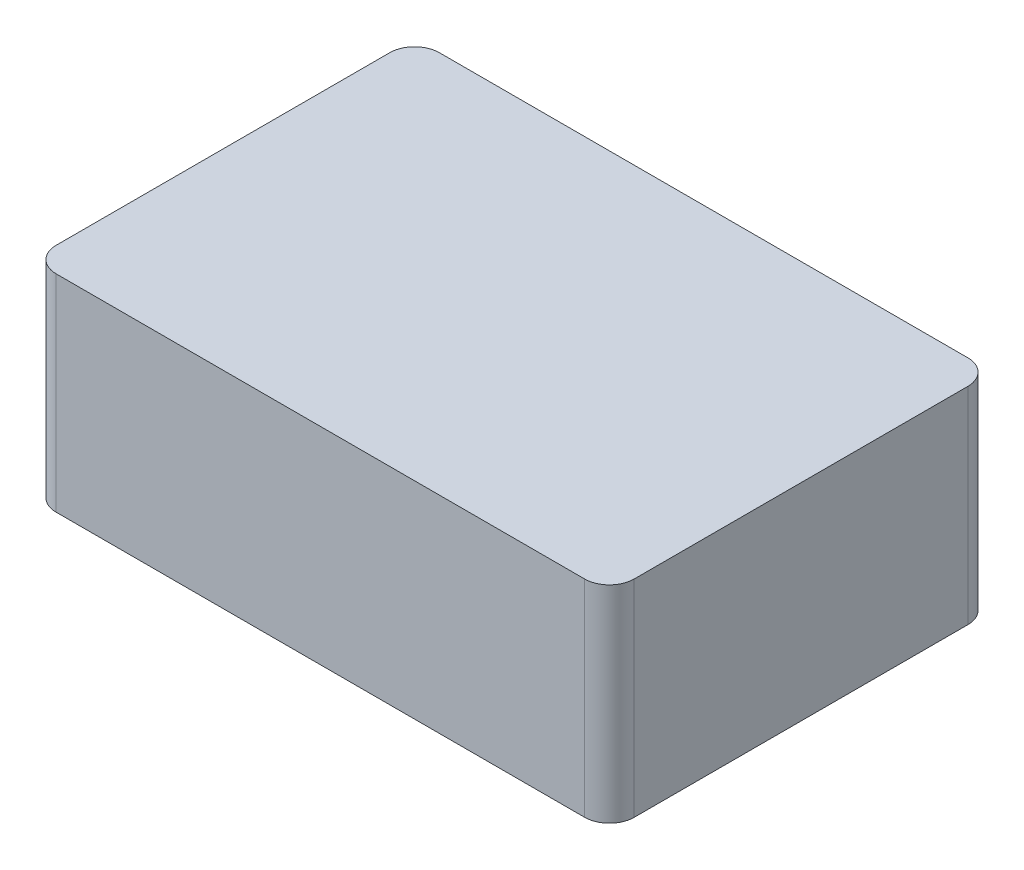
ISO-10303-21;
HEADER;
FILE_DESCRIPTION(('STEP AP214'),'2;1');
FILE_NAME('part.step','',(''),(''),'','','');
FILE_SCHEMA(('AUTOMOTIVE_DESIGN { 1 0 10303 214 1 1 1 1 }'));
ENDSEC;
DATA;
#1=APPLICATION_CONTEXT('core data for automotive mechanical design processes');
#2=APPLICATION_PROTOCOL_DEFINITION('international standard','automotive_design',2000,#1);
#3=PRODUCT_CONTEXT('',#1,'mechanical');
#4=PRODUCT('Part','Part','',(#3));
#5=PRODUCT_RELATED_PRODUCT_CATEGORY('part','',(#4));
#6=PRODUCT_DEFINITION_FORMATION('','',#4);
#7=PRODUCT_DEFINITION_CONTEXT('part definition',#1,'design');
#8=PRODUCT_DEFINITION('design','',#6,#7);
#9=PRODUCT_DEFINITION_SHAPE('','',#8);
#10=(LENGTH_UNIT() NAMED_UNIT(*) SI_UNIT(.MILLI.,.METRE.));
#11=(NAMED_UNIT(*) PLANE_ANGLE_UNIT() SI_UNIT($,.RADIAN.));
#12=(NAMED_UNIT(*) SI_UNIT($,.STERADIAN.) SOLID_ANGLE_UNIT());
#13=UNCERTAINTY_MEASURE_WITH_UNIT(LENGTH_MEASURE(1.E-05),#10,'distance_accuracy_value','');
#14=(GEOMETRIC_REPRESENTATION_CONTEXT(3) GLOBAL_UNCERTAINTY_ASSIGNED_CONTEXT((#13)) GLOBAL_UNIT_ASSIGNED_CONTEXT((#10,
#11,#12)) REPRESENTATION_CONTEXT('',''));
#15=CARTESIAN_POINT('',(0.,0.,0.));
#16=DIRECTION('',(0.,0.,1.));
#17=DIRECTION('',(1.,0.,0.));
#18=AXIS2_PLACEMENT_3D('',#15,#16,#17);
#19=CARTESIAN_POINT('',(35.,25.,23.2));
#20=DIRECTION('',(-1.,0.,0.));
#21=DIRECTION('',(0.,0.,1.));
#22=AXIS2_PLACEMENT_3D('',#19,#20,#21);
#23=PLANE('',#22);
#24=DIRECTION('',(0.,0.,-1.));
#25=VECTOR('',#24,1.);
#26=CARTESIAN_POINT('',(35.,0.,23.2));
#27=LINE('',#26,#25);
#28=CARTESIAN_POINT('',(35.,0.,20.2));
#29=VERTEX_POINT('',#28);
#30=CARTESIAN_POINT('',(35.,0.,-20.2));
#31=VERTEX_POINT('',#30);
#32=EDGE_CURVE('E125',#29,#31,#27,.T.);
#33=ORIENTED_EDGE('',*,*,#32,.T.);
#34=DIRECTION('',(0.,-1.,0.));
#35=VECTOR('',#34,1.);
#36=CARTESIAN_POINT('',(35.,25.,-20.2));
#37=LINE('',#36,#35);
#38=CARTESIAN_POINT('',(35.,25.,-20.2));
#39=VERTEX_POINT('',#38);
#40=EDGE_CURVE('E103',#31,#39,#37,.F.);
#41=ORIENTED_EDGE('',*,*,#40,.T.);
#42=DIRECTION('',(0.,0.,-1.));
#43=VECTOR('',#42,1.);
#44=CARTESIAN_POINT('',(35.,25.,23.2));
#45=LINE('',#44,#43);
#46=CARTESIAN_POINT('',(35.,25.,20.2));
#47=VERTEX_POINT('',#46);
#48=EDGE_CURVE('E134',#47,#39,#45,.T.);
#49=ORIENTED_EDGE('',*,*,#48,.F.);
#50=DIRECTION('',(0.,-1.,0.));
#51=VECTOR('',#50,1.);
#52=CARTESIAN_POINT('',(35.,25.,20.2));
#53=LINE('',#52,#51);
#54=EDGE_CURVE('E108',#47,#29,#53,.T.);
#55=ORIENTED_EDGE('',*,*,#54,.T.);
#56=EDGE_LOOP('',(#33,#41,#49,#55));
#57=FACE_BOUND('',#56,.T.);
#58=ADVANCED_FACE('F32',(#57),#23,.F.);
#59=CARTESIAN_POINT('',(-35.,25.,-23.2));
#60=DIRECTION('',(0.,0.,1.));
#61=DIRECTION('',(1.,0.,0.));
#62=AXIS2_PLACEMENT_3D('',#59,#60,#61);
#63=PLANE('',#62);
#64=DIRECTION('',(-1.,0.,0.));
#65=VECTOR('',#64,1.);
#66=CARTESIAN_POINT('',(-35.,25.,-23.2));
#67=LINE('',#66,#65);
#68=CARTESIAN_POINT('',(32.,25.,-23.2));
#69=VERTEX_POINT('',#68);
#70=CARTESIAN_POINT('',(-32.,25.,-23.2));
#71=VERTEX_POINT('',#70);
#72=EDGE_CURVE('E118',#69,#71,#67,.T.);
#73=ORIENTED_EDGE('',*,*,#72,.F.);
#74=DIRECTION('',(0.,-1.,0.));
#75=VECTOR('',#74,1.);
#76=CARTESIAN_POINT('',(32.,25.,-23.2));
#77=LINE('',#76,#75);
#78=CARTESIAN_POINT('',(32.,0.,-23.2));
#79=VERTEX_POINT('',#78);
#80=EDGE_CURVE('E102',#69,#79,#77,.T.);
#81=ORIENTED_EDGE('',*,*,#80,.T.);
#82=DIRECTION('',(-1.,0.,0.));
#83=VECTOR('',#82,1.);
#84=CARTESIAN_POINT('',(-35.,0.,-23.2));
#85=LINE('',#84,#83);
#86=CARTESIAN_POINT('',(-32.,0.,-23.2));
#87=VERTEX_POINT('',#86);
#88=EDGE_CURVE('E115',#79,#87,#85,.T.);
#89=ORIENTED_EDGE('',*,*,#88,.T.);
#90=DIRECTION('',(0.,-1.,0.));
#91=VECTOR('',#90,1.);
#92=CARTESIAN_POINT('',(-32.,25.,-23.2));
#93=LINE('',#92,#91);
#94=EDGE_CURVE('E120',#87,#71,#93,.F.);
#95=ORIENTED_EDGE('',*,*,#94,.T.);
#96=EDGE_LOOP('',(#73,#81,#89,#95));
#97=FACE_BOUND('',#96,.T.);
#98=ADVANCED_FACE('F114',(#97),#63,.F.);
#99=CARTESIAN_POINT('',(-35.,25.,23.2));
#100=DIRECTION('',(1.,0.,0.));
#101=DIRECTION('',(0.,0.,-1.));
#102=AXIS2_PLACEMENT_3D('',#99,#100,#101);
#103=PLANE('',#102);
#104=DIRECTION('',(0.,0.,1.));
#105=VECTOR('',#104,1.);
#106=CARTESIAN_POINT('',(-35.,25.,23.2));
#107=LINE('',#106,#105);
#108=CARTESIAN_POINT('',(-35.,25.,-20.2));
#109=VERTEX_POINT('',#108);
#110=CARTESIAN_POINT('',(-35.,25.,20.2));
#111=VERTEX_POINT('',#110);
#112=EDGE_CURVE('E160',#109,#111,#107,.T.);
#113=ORIENTED_EDGE('',*,*,#112,.F.);
#114=DIRECTION('',(0.,-1.,0.));
#115=VECTOR('',#114,1.);
#116=CARTESIAN_POINT('',(-35.,25.,-20.2));
#117=LINE('',#116,#115);
#118=CARTESIAN_POINT('',(-35.,0.,-20.2));
#119=VERTEX_POINT('',#118);
#120=EDGE_CURVE('E153',#109,#119,#117,.T.);
#121=ORIENTED_EDGE('',*,*,#120,.T.);
#122=DIRECTION('',(0.,0.,1.));
#123=VECTOR('',#122,1.);
#124=CARTESIAN_POINT('',(-35.,0.,23.2));
#125=LINE('',#124,#123);
#126=CARTESIAN_POINT('',(-35.,0.,20.2));
#127=VERTEX_POINT('',#126);
#128=EDGE_CURVE('E124',#119,#127,#125,.T.);
#129=ORIENTED_EDGE('',*,*,#128,.T.);
#130=DIRECTION('',(0.,-1.,0.));
#131=VECTOR('',#130,1.);
#132=CARTESIAN_POINT('',(-35.,25.,20.2));
#133=LINE('',#132,#131);
#134=EDGE_CURVE('E151',#127,#111,#133,.F.);
#135=ORIENTED_EDGE('',*,*,#134,.T.);
#136=EDGE_LOOP('',(#113,#121,#129,#135));
#137=FACE_BOUND('',#136,.T.);
#138=ADVANCED_FACE('F158',(#137),#103,.F.);
#139=CARTESIAN_POINT('',(-35.,25.,23.2));
#140=DIRECTION('',(0.,0.,-1.));
#141=DIRECTION('',(-1.,0.,0.));
#142=AXIS2_PLACEMENT_3D('',#139,#140,#141);
#143=PLANE('',#142);
#144=DIRECTION('',(1.,0.,0.));
#145=VECTOR('',#144,1.);
#146=CARTESIAN_POINT('',(-35.,25.,23.2));
#147=LINE('',#146,#145);
#148=CARTESIAN_POINT('',(-32.,25.,23.2));
#149=VERTEX_POINT('',#148);
#150=CARTESIAN_POINT('',(32.,25.,23.2));
#151=VERTEX_POINT('',#150);
#152=EDGE_CURVE('E135',#149,#151,#147,.T.);
#153=ORIENTED_EDGE('',*,*,#152,.F.);
#154=DIRECTION('',(0.,-1.,0.));
#155=VECTOR('',#154,1.);
#156=CARTESIAN_POINT('',(-32.,25.,23.2));
#157=LINE('',#156,#155);
#158=CARTESIAN_POINT('',(-32.,0.,23.2));
#159=VERTEX_POINT('',#158);
#160=EDGE_CURVE('E11',#149,#159,#157,.T.);
#161=ORIENTED_EDGE('',*,*,#160,.T.);
#162=DIRECTION('',(1.,0.,0.));
#163=VECTOR('',#162,1.);
#164=CARTESIAN_POINT('',(-35.,0.,23.2));
#165=LINE('',#164,#163);
#166=CARTESIAN_POINT('',(32.,0.,23.2));
#167=VERTEX_POINT('',#166);
#168=EDGE_CURVE('E128',#159,#167,#165,.T.);
#169=ORIENTED_EDGE('',*,*,#168,.T.);
#170=DIRECTION('',(0.,-1.,0.));
#171=VECTOR('',#170,1.);
#172=CARTESIAN_POINT('',(32.,25.,23.2));
#173=LINE('',#172,#171);
#174=EDGE_CURVE('E40',#167,#151,#173,.F.);
#175=ORIENTED_EDGE('',*,*,#174,.T.);
#176=EDGE_LOOP('',(#153,#161,#169,#175));
#177=FACE_BOUND('',#176,.T.);
#178=ADVANCED_FACE('F167',(#177),#143,.F.);
#179=CARTESIAN_POINT('',(0.,25.,0.));
#180=DIRECTION('',(0.,-1.,0.));
#181=DIRECTION('',(0.,0.,-1.));
#182=AXIS2_PLACEMENT_3D('',#179,#180,#181);
#183=PLANE('',#182);
#184=ORIENTED_EDGE('',*,*,#48,.T.);
#185=CARTESIAN_POINT('',(32.,25.,-20.2));
#186=DIRECTION('',(0.,-1.,0.));
#187=DIRECTION('',(0.,0.,-1.));
#188=AXIS2_PLACEMENT_3D('',#185,#186,#187);
#189=CIRCLE('',#188,3.);
#190=EDGE_CURVE('E149',#39,#69,#189,.F.);
#191=ORIENTED_EDGE('',*,*,#190,.T.);
#192=ORIENTED_EDGE('',*,*,#72,.T.);
#193=CARTESIAN_POINT('',(-32.,25.,-20.2));
#194=DIRECTION('',(0.,-1.,0.));
#195=DIRECTION('',(0.,0.,-1.));
#196=AXIS2_PLACEMENT_3D('',#193,#194,#195);
#197=CIRCLE('',#196,3.);
#198=EDGE_CURVE('E147',#71,#109,#197,.F.);
#199=ORIENTED_EDGE('',*,*,#198,.T.);
#200=ORIENTED_EDGE('',*,*,#112,.T.);
#201=CARTESIAN_POINT('',(-32.,25.,20.2));
#202=DIRECTION('',(0.,-1.,0.));
#203=DIRECTION('',(0.,0.,-1.));
#204=AXIS2_PLACEMENT_3D('',#201,#202,#203);
#205=CIRCLE('',#204,3.);
#206=EDGE_CURVE('E53',#111,#149,#205,.F.);
#207=ORIENTED_EDGE('',*,*,#206,.T.);
#208=ORIENTED_EDGE('',*,*,#152,.T.);
#209=CARTESIAN_POINT('',(32.,25.,20.2));
#210=DIRECTION('',(0.,-1.,0.));
#211=DIRECTION('',(0.,0.,-1.));
#212=AXIS2_PLACEMENT_3D('',#209,#210,#211);
#213=CIRCLE('',#212,3.);
#214=EDGE_CURVE('E144',#151,#47,#213,.F.);
#215=ORIENTED_EDGE('',*,*,#214,.T.);
#216=EDGE_LOOP('',(#184,#191,#192,#199,#200,#207,#208,#215));
#217=FACE_BOUND('',#216,.T.);
#218=ADVANCED_FACE('F174',(#217),#183,.F.);
#219=CARTESIAN_POINT('',(0.,0.,0.));
#220=DIRECTION('',(0.,-1.,0.));
#221=DIRECTION('',(0.,0.,-1.));
#222=AXIS2_PLACEMENT_3D('',#219,#220,#221);
#223=PLANE('',#222);
#224=ORIENTED_EDGE('',*,*,#88,.F.);
#225=CARTESIAN_POINT('',(32.,0.,-20.2));
#226=DIRECTION('',(0.,-1.,0.));
#227=DIRECTION('',(0.,0.,-1.));
#228=AXIS2_PLACEMENT_3D('',#225,#226,#227);
#229=CIRCLE('',#228,3.);
#230=EDGE_CURVE('E98',#79,#31,#229,.T.);
#231=ORIENTED_EDGE('',*,*,#230,.T.);
#232=ORIENTED_EDGE('',*,*,#32,.F.);
#233=CARTESIAN_POINT('',(32.,0.,20.2));
#234=DIRECTION('',(0.,-1.,0.));
#235=DIRECTION('',(0.,0.,-1.));
#236=AXIS2_PLACEMENT_3D('',#233,#234,#235);
#237=CIRCLE('',#236,3.);
#238=EDGE_CURVE('E119',#29,#167,#237,.T.);
#239=ORIENTED_EDGE('',*,*,#238,.T.);
#240=ORIENTED_EDGE('',*,*,#168,.F.);
#241=CARTESIAN_POINT('',(-32.,0.,20.2));
#242=DIRECTION('',(0.,-1.,0.));
#243=DIRECTION('',(0.,0.,-1.));
#244=AXIS2_PLACEMENT_3D('',#241,#242,#243);
#245=CIRCLE('',#244,3.);
#246=EDGE_CURVE('E138',#159,#127,#245,.T.);
#247=ORIENTED_EDGE('',*,*,#246,.T.);
#248=ORIENTED_EDGE('',*,*,#128,.F.);
#249=CARTESIAN_POINT('',(-32.,0.,-20.2));
#250=DIRECTION('',(0.,-1.,0.));
#251=DIRECTION('',(0.,0.,-1.));
#252=AXIS2_PLACEMENT_3D('',#249,#250,#251);
#253=CIRCLE('',#252,3.);
#254=EDGE_CURVE('E109',#119,#87,#253,.T.);
#255=ORIENTED_EDGE('',*,*,#254,.T.);
#256=EDGE_LOOP('',(#224,#231,#232,#239,#240,#247,#248,#255));
#257=FACE_BOUND('',#256,.T.);
#258=ADVANCED_FACE('F122',(#257),#223,.T.);
#259=CARTESIAN_POINT('',(32.,25.,-20.2));
#260=DIRECTION('',(0.,-1.,0.));
#261=DIRECTION('',(0.,0.,-1.));
#262=AXIS2_PLACEMENT_3D('',#259,#260,#261);
#263=CYLINDRICAL_SURFACE('',#262,3.);
#264=ORIENTED_EDGE('',*,*,#190,.F.);
#265=ORIENTED_EDGE('',*,*,#40,.F.);
#266=ORIENTED_EDGE('',*,*,#230,.F.);
#267=ORIENTED_EDGE('',*,*,#80,.F.);
#268=EDGE_LOOP('',(#264,#265,#266,#267));
#269=FACE_BOUND('',#268,.T.);
#270=ADVANCED_FACE('F101',(#269),#263,.T.);
#271=CARTESIAN_POINT('',(-32.,25.,-20.2));
#272=DIRECTION('',(0.,-1.,0.));
#273=DIRECTION('',(0.,0.,-1.));
#274=AXIS2_PLACEMENT_3D('',#271,#272,#273);
#275=CYLINDRICAL_SURFACE('',#274,3.);
#276=ORIENTED_EDGE('',*,*,#198,.F.);
#277=ORIENTED_EDGE('',*,*,#94,.F.);
#278=ORIENTED_EDGE('',*,*,#254,.F.);
#279=ORIENTED_EDGE('',*,*,#120,.F.);
#280=EDGE_LOOP('',(#276,#277,#278,#279));
#281=FACE_BOUND('',#280,.T.);
#282=ADVANCED_FACE('F182',(#281),#275,.T.);
#283=CARTESIAN_POINT('',(-32.,25.,20.2));
#284=DIRECTION('',(0.,-1.,0.));
#285=DIRECTION('',(0.,0.,-1.));
#286=AXIS2_PLACEMENT_3D('',#283,#284,#285);
#287=CYLINDRICAL_SURFACE('',#286,3.);
#288=ORIENTED_EDGE('',*,*,#206,.F.);
#289=ORIENTED_EDGE('',*,*,#134,.F.);
#290=ORIENTED_EDGE('',*,*,#246,.F.);
#291=ORIENTED_EDGE('',*,*,#160,.F.);
#292=EDGE_LOOP('',(#288,#289,#290,#291));
#293=FACE_BOUND('',#292,.T.);
#294=ADVANCED_FACE('F166',(#293),#287,.T.);
#295=CARTESIAN_POINT('',(32.,25.,20.2));
#296=DIRECTION('',(0.,-1.,0.));
#297=DIRECTION('',(0.,0.,-1.));
#298=AXIS2_PLACEMENT_3D('',#295,#296,#297);
#299=CYLINDRICAL_SURFACE('',#298,3.);
#300=ORIENTED_EDGE('',*,*,#214,.F.);
#301=ORIENTED_EDGE('',*,*,#174,.F.);
#302=ORIENTED_EDGE('',*,*,#238,.F.);
#303=ORIENTED_EDGE('',*,*,#54,.F.);
#304=EDGE_LOOP('',(#300,#301,#302,#303));
#305=FACE_BOUND('',#304,.T.);
#306=ADVANCED_FACE('F34',(#305),#299,.T.);
#307=CLOSED_SHELL('',(#58,#98,#138,#178,#218,#258,#270,#282,#294,#306));
#308=MANIFOLD_SOLID_BREP('B2',#307);
#309=ADVANCED_BREP_SHAPE_REPRESENTATION('',(#18,#308),#14);
#310=SHAPE_DEFINITION_REPRESENTATION(#9,#309);
ENDSEC;
END-ISO-10303-21;
